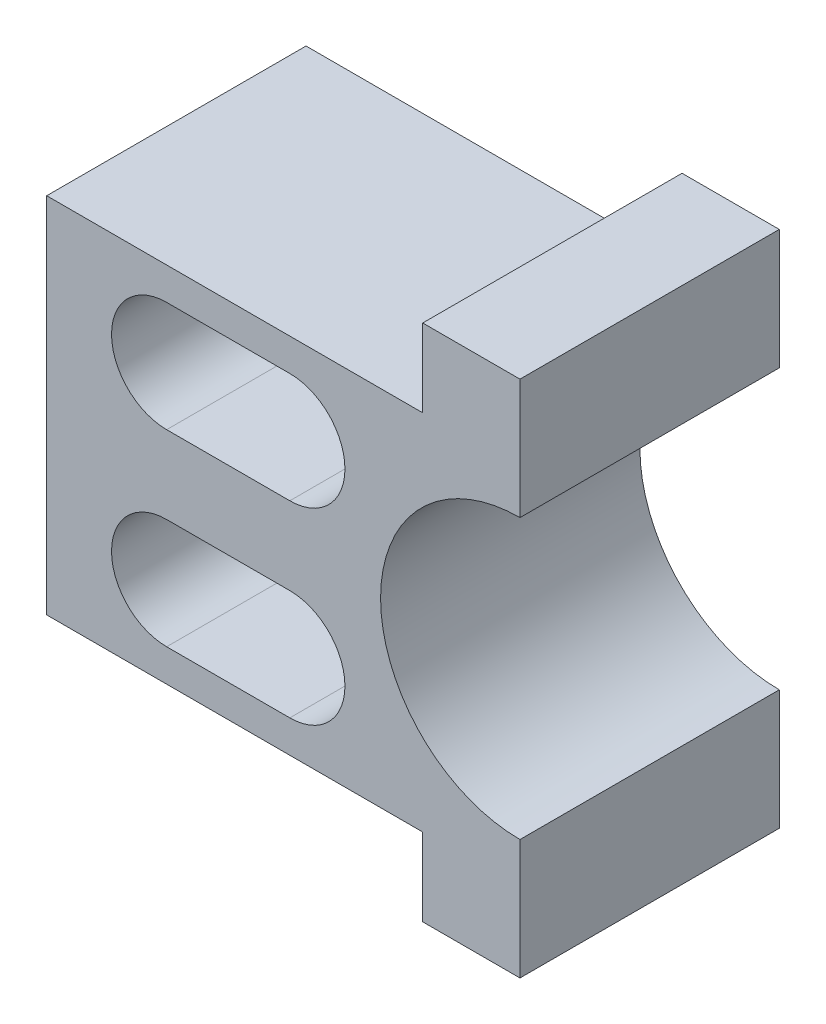
ISO-10303-21;
HEADER;
FILE_DESCRIPTION(('STEP AP214'),'2;1');
FILE_NAME('part.step','',(''),(''),'','','');
FILE_SCHEMA(('AUTOMOTIVE_DESIGN { 1 0 10303 214 1 1 1 1 }'));
ENDSEC;
DATA;
#1=APPLICATION_CONTEXT('core data for automotive mechanical design processes');
#2=APPLICATION_PROTOCOL_DEFINITION('international standard','automotive_design',2000,#1);
#3=PRODUCT_CONTEXT('',#1,'mechanical');
#4=PRODUCT('Part','Part','',(#3));
#5=PRODUCT_RELATED_PRODUCT_CATEGORY('part','',(#4));
#6=PRODUCT_DEFINITION_FORMATION('','',#4);
#7=PRODUCT_DEFINITION_CONTEXT('part definition',#1,'design');
#8=PRODUCT_DEFINITION('design','',#6,#7);
#9=PRODUCT_DEFINITION_SHAPE('','',#8);
#10=(LENGTH_UNIT() NAMED_UNIT(*) SI_UNIT(.MILLI.,.METRE.));
#11=(NAMED_UNIT(*) PLANE_ANGLE_UNIT() SI_UNIT($,.RADIAN.));
#12=(NAMED_UNIT(*) SI_UNIT($,.STERADIAN.) SOLID_ANGLE_UNIT());
#13=UNCERTAINTY_MEASURE_WITH_UNIT(LENGTH_MEASURE(1.E-05),#10,'distance_accuracy_value','');
#14=(GEOMETRIC_REPRESENTATION_CONTEXT(3) GLOBAL_UNCERTAINTY_ASSIGNED_CONTEXT((#13)) GLOBAL_UNIT_ASSIGNED_CONTEXT((#10,
#11,#12)) REPRESENTATION_CONTEXT('',''));
#15=CARTESIAN_POINT('',(0.,0.,0.));
#16=DIRECTION('',(0.,0.,1.));
#17=DIRECTION('',(1.,0.,0.));
#18=AXIS2_PLACEMENT_3D('',#15,#16,#17);
#19=CARTESIAN_POINT('',(0.,0.,40.));
#20=DIRECTION('',(0.,0.,-1.));
#21=DIRECTION('',(-1.,0.,0.));
#22=AXIS2_PLACEMENT_3D('',#19,#20,#21);
#23=PLANE('',#22);
#24=DIRECTION('',(1.,0.,0.));
#25=VECTOR('',#24,1.);
#26=CARTESIAN_POINT('',(-18.,-23.,40.));
#27=LINE('',#26,#25);
#28=CARTESIAN_POINT('',(-18.,-23.,40.));
#29=VERTEX_POINT('',#28);
#30=CARTESIAN_POINT('',(0.999999999999958,-23.,40.));
#31=VERTEX_POINT('',#30);
#32=EDGE_CURVE('E277',#29,#31,#27,.T.);
#33=ORIENTED_EDGE('',*,*,#32,.F.);
#34=CARTESIAN_POINT('',(-18.,-14.5,40.));
#35=DIRECTION('',(0.,0.,1.));
#36=DIRECTION('',(1.,0.,0.));
#37=AXIS2_PLACEMENT_3D('',#34,#35,#36);
#38=CIRCLE('',#37,8.5);
#39=CARTESIAN_POINT('',(-18.,-6.,40.));
#40=VERTEX_POINT('',#39);
#41=EDGE_CURVE('E274',#40,#29,#38,.T.);
#42=ORIENTED_EDGE('',*,*,#41,.F.);
#43=DIRECTION('',(-1.,0.,0.));
#44=VECTOR('',#43,1.);
#45=CARTESIAN_POINT('',(-18.,-6.,40.));
#46=LINE('',#45,#44);
#47=CARTESIAN_POINT('',(0.999999999999959,-6.,40.));
#48=VERTEX_POINT('',#47);
#49=EDGE_CURVE('E263',#48,#40,#46,.T.);
#50=ORIENTED_EDGE('',*,*,#49,.F.);
#51=CARTESIAN_POINT('',(0.999999999999959,-14.5,40.));
#52=DIRECTION('',(0.,0.,1.));
#53=DIRECTION('',(1.,0.,0.));
#54=AXIS2_PLACEMENT_3D('',#51,#52,#53);
#55=CIRCLE('',#54,8.5);
#56=EDGE_CURVE('E280',#31,#48,#55,.T.);
#57=ORIENTED_EDGE('',*,*,#56,.F.);
#58=EDGE_LOOP('',(#33,#42,#50,#57));
#59=FACE_BOUND('',#58,.T.);
#60=DIRECTION('',(1.,0.,0.));
#61=VECTOR('',#60,1.);
#62=CARTESIAN_POINT('',(-18.,6.,40.));
#63=LINE('',#62,#61);
#64=CARTESIAN_POINT('',(-18.,6.,40.));
#65=VERTEX_POINT('',#64);
#66=CARTESIAN_POINT('',(0.999999999999959,6.,40.));
#67=VERTEX_POINT('',#66);
#68=EDGE_CURVE('E243',#65,#67,#63,.T.);
#69=ORIENTED_EDGE('',*,*,#68,.F.);
#70=CARTESIAN_POINT('',(-18.,14.5,40.));
#71=DIRECTION('',(0.,0.,1.));
#72=DIRECTION('',(-1.,0.,0.));
#73=AXIS2_PLACEMENT_3D('',#70,#71,#72);
#74=CIRCLE('',#73,8.5);
#75=CARTESIAN_POINT('',(-18.,23.,40.));
#76=VERTEX_POINT('',#75);
#77=EDGE_CURVE('E240',#76,#65,#74,.T.);
#78=ORIENTED_EDGE('',*,*,#77,.F.);
#79=DIRECTION('',(-1.,0.,0.));
#80=VECTOR('',#79,1.);
#81=CARTESIAN_POINT('',(-18.,23.,40.));
#82=LINE('',#81,#80);
#83=CARTESIAN_POINT('',(0.999999999999959,23.,40.));
#84=VERTEX_POINT('',#83);
#85=EDGE_CURVE('E229',#84,#76,#82,.T.);
#86=ORIENTED_EDGE('',*,*,#85,.F.);
#87=CARTESIAN_POINT('',(0.999999999999959,14.5,40.));
#88=DIRECTION('',(0.,0.,1.));
#89=DIRECTION('',(-1.,0.,0.));
#90=AXIS2_PLACEMENT_3D('',#87,#88,#89);
#91=CIRCLE('',#90,8.5);
#92=EDGE_CURVE('E246',#67,#84,#91,.T.);
#93=ORIENTED_EDGE('',*,*,#92,.F.);
#94=EDGE_LOOP('',(#69,#78,#86,#93));
#95=FACE_BOUND('',#94,.T.);
#96=DIRECTION('',(1.,0.,0.));
#97=VECTOR('',#96,1.);
#98=CARTESIAN_POINT('',(-36.5,-28.,40.));
#99=LINE('',#98,#97);
#100=CARTESIAN_POINT('',(-36.5,-28.,40.));
#101=VERTEX_POINT('',#100);
#102=CARTESIAN_POINT('',(21.5,-28.,40.));
#103=VERTEX_POINT('',#102);
#104=EDGE_CURVE('E170',#101,#103,#99,.T.);
#105=ORIENTED_EDGE('',*,*,#104,.T.);
#106=DIRECTION('',(0.,1.,0.));
#107=VECTOR('',#106,1.);
#108=CARTESIAN_POINT('',(21.5,-40.,40.));
#109=LINE('',#108,#107);
#110=CARTESIAN_POINT('',(21.5,-40.,40.));
#111=VERTEX_POINT('',#110);
#112=EDGE_CURVE('E184',#111,#103,#109,.T.);
#113=ORIENTED_EDGE('',*,*,#112,.F.);
#114=DIRECTION('',(1.,0.,0.));
#115=VECTOR('',#114,1.);
#116=CARTESIAN_POINT('',(36.5,-40.,40.));
#117=LINE('',#116,#115);
#118=CARTESIAN_POINT('',(36.5,-40.,40.));
#119=VERTEX_POINT('',#118);
#120=EDGE_CURVE('E219',#111,#119,#117,.T.);
#121=ORIENTED_EDGE('',*,*,#120,.T.);
#122=DIRECTION('',(0.,1.,0.));
#123=VECTOR('',#122,1.);
#124=CARTESIAN_POINT('',(36.5,40.,40.));
#125=LINE('',#124,#123);
#126=CARTESIAN_POINT('',(36.5,-21.5,40.));
#127=VERTEX_POINT('',#126);
#128=EDGE_CURVE('E212',#119,#127,#125,.T.);
#129=ORIENTED_EDGE('',*,*,#128,.T.);
#130=CARTESIAN_POINT('',(36.5,0.,40.));
#131=DIRECTION('',(0.,0.,1.));
#132=DIRECTION('',(1.,0.,0.));
#133=AXIS2_PLACEMENT_3D('',#130,#131,#132);
#134=CIRCLE('',#133,21.5);
#135=CARTESIAN_POINT('',(36.5,21.5,40.));
#136=VERTEX_POINT('',#135);
#137=EDGE_CURVE('E276',#136,#127,#134,.T.);
#138=ORIENTED_EDGE('',*,*,#137,.F.);
#139=CARTESIAN_POINT('',(36.5,40.,40.));
#140=VERTEX_POINT('',#139);
#141=EDGE_CURVE('E216',#136,#140,#125,.T.);
#142=ORIENTED_EDGE('',*,*,#141,.T.);
#143=DIRECTION('',(-1.,0.,0.));
#144=VECTOR('',#143,1.);
#145=CARTESIAN_POINT('',(36.5,40.,40.));
#146=LINE('',#145,#144);
#147=CARTESIAN_POINT('',(21.5,40.,40.));
#148=VERTEX_POINT('',#147);
#149=EDGE_CURVE('E197',#140,#148,#146,.T.);
#150=ORIENTED_EDGE('',*,*,#149,.T.);
#151=DIRECTION('',(0.,-1.,0.));
#152=VECTOR('',#151,1.);
#153=CARTESIAN_POINT('',(21.5,40.,40.));
#154=LINE('',#153,#152);
#155=CARTESIAN_POINT('',(21.5,28.,40.));
#156=VERTEX_POINT('',#155);
#157=EDGE_CURVE('E175',#148,#156,#154,.T.);
#158=ORIENTED_EDGE('',*,*,#157,.T.);
#159=DIRECTION('',(1.,0.,0.));
#160=VECTOR('',#159,1.);
#161=CARTESIAN_POINT('',(-36.5,28.,40.));
#162=LINE('',#161,#160);
#163=CARTESIAN_POINT('',(-36.5,28.,40.));
#164=VERTEX_POINT('',#163);
#165=EDGE_CURVE('E300',#164,#156,#162,.T.);
#166=ORIENTED_EDGE('',*,*,#165,.F.);
#167=DIRECTION('',(0.,-1.,0.));
#168=VECTOR('',#167,1.);
#169=CARTESIAN_POINT('',(-36.5,40.,40.));
#170=LINE('',#169,#168);
#171=EDGE_CURVE('E205',#164,#101,#170,.T.);
#172=ORIENTED_EDGE('',*,*,#171,.T.);
#173=EDGE_LOOP('',(#105,#113,#121,#129,#138,#142,#150,#158,#166,#172));
#174=FACE_BOUND('',#173,.T.);
#175=ADVANCED_FACE('F40',(#59,#95,#174),#23,.F.);
#176=CARTESIAN_POINT('',(0.,0.,0.));
#177=DIRECTION('',(0.,0.,-1.));
#178=DIRECTION('',(-1.,0.,0.));
#179=AXIS2_PLACEMENT_3D('',#176,#177,#178);
#180=PLANE('',#179);
#181=CARTESIAN_POINT('',(-18.,-14.5,0.));
#182=DIRECTION('',(0.,0.,1.));
#183=DIRECTION('',(1.,0.,0.));
#184=AXIS2_PLACEMENT_3D('',#181,#182,#183);
#185=CIRCLE('',#184,8.5);
#186=CARTESIAN_POINT('',(-18.,-6.,0.));
#187=VERTEX_POINT('',#186);
#188=CARTESIAN_POINT('',(-18.,-23.,0.));
#189=VERTEX_POINT('',#188);
#190=EDGE_CURVE('E260',#187,#189,#185,.T.);
#191=ORIENTED_EDGE('',*,*,#190,.T.);
#192=DIRECTION('',(1.,0.,0.));
#193=VECTOR('',#192,1.);
#194=CARTESIAN_POINT('',(-18.,-23.,0.));
#195=LINE('',#194,#193);
#196=CARTESIAN_POINT('',(0.999999999999958,-23.,0.));
#197=VERTEX_POINT('',#196);
#198=EDGE_CURVE('E264',#189,#197,#195,.T.);
#199=ORIENTED_EDGE('',*,*,#198,.T.);
#200=CARTESIAN_POINT('',(0.999999999999959,-14.5,0.));
#201=DIRECTION('',(0.,0.,1.));
#202=DIRECTION('',(1.,0.,0.));
#203=AXIS2_PLACEMENT_3D('',#200,#201,#202);
#204=CIRCLE('',#203,8.5);
#205=CARTESIAN_POINT('',(0.999999999999959,-6.,0.));
#206=VERTEX_POINT('',#205);
#207=EDGE_CURVE('E267',#197,#206,#204,.T.);
#208=ORIENTED_EDGE('',*,*,#207,.T.);
#209=DIRECTION('',(-1.,0.,0.));
#210=VECTOR('',#209,1.);
#211=CARTESIAN_POINT('',(-18.,-6.,0.));
#212=LINE('',#211,#210);
#213=EDGE_CURVE('E270',#206,#187,#212,.T.);
#214=ORIENTED_EDGE('',*,*,#213,.T.);
#215=EDGE_LOOP('',(#191,#199,#208,#214));
#216=FACE_BOUND('',#215,.T.);
#217=CARTESIAN_POINT('',(-18.,14.5,0.));
#218=DIRECTION('',(0.,0.,1.));
#219=DIRECTION('',(-1.,0.,0.));
#220=AXIS2_PLACEMENT_3D('',#217,#218,#219);
#221=CIRCLE('',#220,8.5);
#222=CARTESIAN_POINT('',(-18.,23.,0.));
#223=VERTEX_POINT('',#222);
#224=CARTESIAN_POINT('',(-18.,6.,0.));
#225=VERTEX_POINT('',#224);
#226=EDGE_CURVE('E226',#223,#225,#221,.T.);
#227=ORIENTED_EDGE('',*,*,#226,.T.);
#228=DIRECTION('',(1.,0.,0.));
#229=VECTOR('',#228,1.);
#230=CARTESIAN_POINT('',(-18.,6.,0.));
#231=LINE('',#230,#229);
#232=CARTESIAN_POINT('',(0.999999999999959,6.,0.));
#233=VERTEX_POINT('',#232);
#234=EDGE_CURVE('E230',#225,#233,#231,.T.);
#235=ORIENTED_EDGE('',*,*,#234,.T.);
#236=CARTESIAN_POINT('',(0.999999999999959,14.5,0.));
#237=DIRECTION('',(0.,0.,1.));
#238=DIRECTION('',(-1.,0.,0.));
#239=AXIS2_PLACEMENT_3D('',#236,#237,#238);
#240=CIRCLE('',#239,8.5);
#241=CARTESIAN_POINT('',(0.999999999999959,23.,0.));
#242=VERTEX_POINT('',#241);
#243=EDGE_CURVE('E233',#233,#242,#240,.T.);
#244=ORIENTED_EDGE('',*,*,#243,.T.);
#245=DIRECTION('',(-1.,0.,0.));
#246=VECTOR('',#245,1.);
#247=CARTESIAN_POINT('',(-18.,23.,0.));
#248=LINE('',#247,#246);
#249=EDGE_CURVE('E236',#242,#223,#248,.T.);
#250=ORIENTED_EDGE('',*,*,#249,.T.);
#251=EDGE_LOOP('',(#227,#235,#244,#250));
#252=FACE_BOUND('',#251,.T.);
#253=DIRECTION('',(0.,1.,0.));
#254=VECTOR('',#253,1.);
#255=CARTESIAN_POINT('',(21.5,-40.,0.));
#256=LINE('',#255,#254);
#257=CARTESIAN_POINT('',(21.5,-40.,0.));
#258=VERTEX_POINT('',#257);
#259=CARTESIAN_POINT('',(21.5,-28.,0.));
#260=VERTEX_POINT('',#259);
#261=EDGE_CURVE('E55',#258,#260,#256,.T.);
#262=ORIENTED_EDGE('',*,*,#261,.T.);
#263=DIRECTION('',(1.,0.,0.));
#264=VECTOR('',#263,1.);
#265=CARTESIAN_POINT('',(-36.5,-28.,0.));
#266=LINE('',#265,#264);
#267=CARTESIAN_POINT('',(-36.5,-28.,0.));
#268=VERTEX_POINT('',#267);
#269=EDGE_CURVE('E168',#268,#260,#266,.T.);
#270=ORIENTED_EDGE('',*,*,#269,.F.);
#271=DIRECTION('',(0.,-1.,0.));
#272=VECTOR('',#271,1.);
#273=CARTESIAN_POINT('',(-36.5,40.,0.));
#274=LINE('',#273,#272);
#275=CARTESIAN_POINT('',(-36.5,28.,0.));
#276=VERTEX_POINT('',#275);
#277=EDGE_CURVE('E182',#276,#268,#274,.T.);
#278=ORIENTED_EDGE('',*,*,#277,.F.);
#279=DIRECTION('',(1.,0.,0.));
#280=VECTOR('',#279,1.);
#281=CARTESIAN_POINT('',(-36.5,28.,0.));
#282=LINE('',#281,#280);
#283=CARTESIAN_POINT('',(21.5,28.,0.));
#284=VERTEX_POINT('',#283);
#285=EDGE_CURVE('E299',#276,#284,#282,.T.);
#286=ORIENTED_EDGE('',*,*,#285,.T.);
#287=DIRECTION('',(0.,-1.,0.));
#288=VECTOR('',#287,1.);
#289=CARTESIAN_POINT('',(21.5,40.,0.));
#290=LINE('',#289,#288);
#291=CARTESIAN_POINT('',(21.5,40.,0.));
#292=VERTEX_POINT('',#291);
#293=EDGE_CURVE('E302',#292,#284,#290,.T.);
#294=ORIENTED_EDGE('',*,*,#293,.F.);
#295=DIRECTION('',(-1.,0.,0.));
#296=VECTOR('',#295,1.);
#297=CARTESIAN_POINT('',(36.5,40.,0.));
#298=LINE('',#297,#296);
#299=CARTESIAN_POINT('',(36.5,40.,0.));
#300=VERTEX_POINT('',#299);
#301=EDGE_CURVE('E203',#300,#292,#298,.T.);
#302=ORIENTED_EDGE('',*,*,#301,.F.);
#303=DIRECTION('',(0.,1.,0.));
#304=VECTOR('',#303,1.);
#305=CARTESIAN_POINT('',(36.5,40.,0.));
#306=LINE('',#305,#304);
#307=CARTESIAN_POINT('',(36.5,21.5,0.));
#308=VERTEX_POINT('',#307);
#309=EDGE_CURVE('E191',#308,#300,#306,.T.);
#310=ORIENTED_EDGE('',*,*,#309,.F.);
#311=CARTESIAN_POINT('',(36.5,0.,0.));
#312=DIRECTION('',(0.,0.,1.));
#313=DIRECTION('',(1.,0.,0.));
#314=AXIS2_PLACEMENT_3D('',#311,#312,#313);
#315=CIRCLE('',#314,21.5);
#316=CARTESIAN_POINT('',(36.5,-21.5,0.));
#317=VERTEX_POINT('',#316);
#318=EDGE_CURVE('E225',#308,#317,#315,.T.);
#319=ORIENTED_EDGE('',*,*,#318,.T.);
#320=CARTESIAN_POINT('',(36.5,-40.,0.));
#321=VERTEX_POINT('',#320);
#322=EDGE_CURVE('E200',#321,#317,#306,.T.);
#323=ORIENTED_EDGE('',*,*,#322,.F.);
#324=DIRECTION('',(1.,0.,0.));
#325=VECTOR('',#324,1.);
#326=CARTESIAN_POINT('',(36.5,-40.,0.));
#327=LINE('',#326,#325);
#328=EDGE_CURVE('E188',#258,#321,#327,.T.);
#329=ORIENTED_EDGE('',*,*,#328,.F.);
#330=EDGE_LOOP('',(#262,#270,#278,#286,#294,#302,#310,#319,#323,#329));
#331=FACE_BOUND('',#330,.T.);
#332=ADVANCED_FACE('F180',(#216,#252,#331),#180,.T.);
#333=CARTESIAN_POINT('',(-36.5,40.,40.));
#334=DIRECTION('',(1.,0.,0.));
#335=DIRECTION('',(0.,1.,0.));
#336=AXIS2_PLACEMENT_3D('',#333,#334,#335);
#337=PLANE('',#336);
#338=DIRECTION('',(0.,0.,1.));
#339=VECTOR('',#338,1.);
#340=CARTESIAN_POINT('',(-36.5,-28.,0.));
#341=LINE('',#340,#339);
#342=EDGE_CURVE('E165',#268,#101,#341,.T.);
#343=ORIENTED_EDGE('',*,*,#342,.T.);
#344=ORIENTED_EDGE('',*,*,#171,.F.);
#345=DIRECTION('',(0.,0.,1.));
#346=VECTOR('',#345,1.);
#347=CARTESIAN_POINT('',(-36.5,28.,0.));
#348=LINE('',#347,#346);
#349=EDGE_CURVE('E187',#276,#164,#348,.T.);
#350=ORIENTED_EDGE('',*,*,#349,.F.);
#351=ORIENTED_EDGE('',*,*,#277,.T.);
#352=EDGE_LOOP('',(#343,#344,#350,#351));
#353=FACE_BOUND('',#352,.T.);
#354=ADVANCED_FACE('F42',(#353),#337,.F.);
#355=CARTESIAN_POINT('',(36.5,40.,40.));
#356=DIRECTION('',(0.,-1.,0.));
#357=DIRECTION('',(1.,0.,0.));
#358=AXIS2_PLACEMENT_3D('',#355,#356,#357);
#359=PLANE('',#358);
#360=DIRECTION('',(0.,0.,1.));
#361=VECTOR('',#360,1.);
#362=CARTESIAN_POINT('',(21.5,40.,0.));
#363=LINE('',#362,#361);
#364=EDGE_CURVE('E254',#292,#148,#363,.T.);
#365=ORIENTED_EDGE('',*,*,#364,.T.);
#366=ORIENTED_EDGE('',*,*,#149,.F.);
#367=DIRECTION('',(0.,0.,-1.));
#368=VECTOR('',#367,1.);
#369=CARTESIAN_POINT('',(36.5,40.,40.));
#370=LINE('',#369,#368);
#371=EDGE_CURVE('E48',#140,#300,#370,.T.);
#372=ORIENTED_EDGE('',*,*,#371,.T.);
#373=ORIENTED_EDGE('',*,*,#301,.T.);
#374=EDGE_LOOP('',(#365,#366,#372,#373));
#375=FACE_BOUND('',#374,.T.);
#376=ADVANCED_FACE('F319',(#375),#359,.F.);
#377=CARTESIAN_POINT('',(36.5,40.,40.));
#378=DIRECTION('',(-1.,0.,0.));
#379=DIRECTION('',(0.,-1.,0.));
#380=AXIS2_PLACEMENT_3D('',#377,#378,#379);
#381=PLANE('',#380);
#382=ORIENTED_EDGE('',*,*,#322,.T.);
#383=DIRECTION('',(0.,0.,1.));
#384=VECTOR('',#383,1.);
#385=CARTESIAN_POINT('',(36.5,-21.5,0.));
#386=LINE('',#385,#384);
#387=EDGE_CURVE('E189',#317,#127,#386,.T.);
#388=ORIENTED_EDGE('',*,*,#387,.T.);
#389=ORIENTED_EDGE('',*,*,#128,.F.);
#390=DIRECTION('',(0.,0.,-1.));
#391=VECTOR('',#390,1.);
#392=CARTESIAN_POINT('',(36.5,-40.,40.));
#393=LINE('',#392,#391);
#394=EDGE_CURVE('E11',#119,#321,#393,.T.);
#395=ORIENTED_EDGE('',*,*,#394,.T.);
#396=EDGE_LOOP('',(#382,#388,#389,#395));
#397=FACE_BOUND('',#396,.T.);
#398=ADVANCED_FACE('F348',(#397),#381,.F.);
#399=CARTESIAN_POINT('',(36.5,-40.,40.));
#400=DIRECTION('',(0.,1.,0.));
#401=DIRECTION('',(-1.,0.,0.));
#402=AXIS2_PLACEMENT_3D('',#399,#400,#401);
#403=PLANE('',#402);
#404=ORIENTED_EDGE('',*,*,#120,.F.);
#405=DIRECTION('',(0.,0.,1.));
#406=VECTOR('',#405,1.);
#407=CARTESIAN_POINT('',(21.5,-40.,0.));
#408=LINE('',#407,#406);
#409=EDGE_CURVE('E307',#258,#111,#408,.T.);
#410=ORIENTED_EDGE('',*,*,#409,.F.);
#411=ORIENTED_EDGE('',*,*,#328,.T.);
#412=ORIENTED_EDGE('',*,*,#394,.F.);
#413=EDGE_LOOP('',(#404,#410,#411,#412));
#414=FACE_BOUND('',#413,.T.);
#415=ADVANCED_FACE('F352',(#414),#403,.F.);
#416=ORIENTED_EDGE('',*,*,#141,.F.);
#417=DIRECTION('',(0.,0.,1.));
#418=VECTOR('',#417,1.);
#419=CARTESIAN_POINT('',(36.5,21.5,0.));
#420=LINE('',#419,#418);
#421=EDGE_CURVE('E194',#136,#308,#420,.F.);
#422=ORIENTED_EDGE('',*,*,#421,.T.);
#423=ORIENTED_EDGE('',*,*,#309,.T.);
#424=ORIENTED_EDGE('',*,*,#371,.F.);
#425=EDGE_LOOP('',(#416,#422,#423,#424));
#426=FACE_BOUND('',#425,.T.);
#427=ADVANCED_FACE('F349',(#426),#381,.F.);
#428=CARTESIAN_POINT('',(-18.,14.5,0.));
#429=DIRECTION('',(0.,0.,1.));
#430=DIRECTION('',(1.,0.,0.));
#431=AXIS2_PLACEMENT_3D('',#428,#429,#430);
#432=CYLINDRICAL_SURFACE('',#431,8.5);
#433=ORIENTED_EDGE('',*,*,#77,.T.);
#434=DIRECTION('',(0.,0.,1.));
#435=VECTOR('',#434,1.);
#436=CARTESIAN_POINT('',(-18.,6.,0.));
#437=LINE('',#436,#435);
#438=EDGE_CURVE('E239',#225,#65,#437,.T.);
#439=ORIENTED_EDGE('',*,*,#438,.F.);
#440=ORIENTED_EDGE('',*,*,#226,.F.);
#441=DIRECTION('',(0.,0.,1.));
#442=VECTOR('',#441,1.);
#443=CARTESIAN_POINT('',(-18.,23.,0.));
#444=LINE('',#443,#442);
#445=EDGE_CURVE('E251',#223,#76,#444,.T.);
#446=ORIENTED_EDGE('',*,*,#445,.T.);
#447=EDGE_LOOP('',(#433,#439,#440,#446));
#448=FACE_BOUND('',#447,.T.);
#449=ADVANCED_FACE('F351',(#448),#432,.F.);
#450=CARTESIAN_POINT('',(-18.,23.,0.));
#451=DIRECTION('',(0.,1.,0.));
#452=DIRECTION('',(0.,0.,1.));
#453=AXIS2_PLACEMENT_3D('',#450,#451,#452);
#454=PLANE('',#453);
#455=ORIENTED_EDGE('',*,*,#85,.T.);
#456=ORIENTED_EDGE('',*,*,#445,.F.);
#457=ORIENTED_EDGE('',*,*,#249,.F.);
#458=DIRECTION('',(0.,0.,1.));
#459=VECTOR('',#458,1.);
#460=CARTESIAN_POINT('',(0.999999999999959,23.,0.));
#461=LINE('',#460,#459);
#462=EDGE_CURVE('E253',#242,#84,#461,.T.);
#463=ORIENTED_EDGE('',*,*,#462,.T.);
#464=EDGE_LOOP('',(#455,#456,#457,#463));
#465=FACE_BOUND('',#464,.T.);
#466=ADVANCED_FACE('F344',(#465),#454,.F.);
#467=CARTESIAN_POINT('',(0.999999999999959,14.5,0.));
#468=DIRECTION('',(0.,0.,1.));
#469=DIRECTION('',(1.,0.,0.));
#470=AXIS2_PLACEMENT_3D('',#467,#468,#469);
#471=CYLINDRICAL_SURFACE('',#470,8.5);
#472=ORIENTED_EDGE('',*,*,#92,.T.);
#473=ORIENTED_EDGE('',*,*,#462,.F.);
#474=ORIENTED_EDGE('',*,*,#243,.F.);
#475=DIRECTION('',(0.,0.,1.));
#476=VECTOR('',#475,1.);
#477=CARTESIAN_POINT('',(0.999999999999959,6.,0.));
#478=LINE('',#477,#476);
#479=EDGE_CURVE('E256',#233,#67,#478,.T.);
#480=ORIENTED_EDGE('',*,*,#479,.T.);
#481=EDGE_LOOP('',(#472,#473,#474,#480));
#482=FACE_BOUND('',#481,.T.);
#483=ADVANCED_FACE('F463',(#482),#471,.F.);
#484=CARTESIAN_POINT('',(-18.,6.,0.));
#485=DIRECTION('',(0.,-1.,0.));
#486=DIRECTION('',(0.,0.,-1.));
#487=AXIS2_PLACEMENT_3D('',#484,#485,#486);
#488=PLANE('',#487);
#489=ORIENTED_EDGE('',*,*,#68,.T.);
#490=ORIENTED_EDGE('',*,*,#479,.F.);
#491=ORIENTED_EDGE('',*,*,#234,.F.);
#492=ORIENTED_EDGE('',*,*,#438,.T.);
#493=EDGE_LOOP('',(#489,#490,#491,#492));
#494=FACE_BOUND('',#493,.T.);
#495=ADVANCED_FACE('F453',(#494),#488,.F.);
#496=CARTESIAN_POINT('',(-18.,-14.5,0.));
#497=DIRECTION('',(0.,0.,1.));
#498=DIRECTION('',(1.,0.,0.));
#499=AXIS2_PLACEMENT_3D('',#496,#497,#498);
#500=CYLINDRICAL_SURFACE('',#499,8.5);
#501=ORIENTED_EDGE('',*,*,#41,.T.);
#502=DIRECTION('',(0.,0.,1.));
#503=VECTOR('',#502,1.);
#504=CARTESIAN_POINT('',(-18.,-23.,0.));
#505=LINE('',#504,#503);
#506=EDGE_CURVE('E273',#189,#29,#505,.T.);
#507=ORIENTED_EDGE('',*,*,#506,.F.);
#508=ORIENTED_EDGE('',*,*,#190,.F.);
#509=DIRECTION('',(0.,0.,1.));
#510=VECTOR('',#509,1.);
#511=CARTESIAN_POINT('',(-18.,-6.,0.));
#512=LINE('',#511,#510);
#513=EDGE_CURVE('E242',#187,#40,#512,.T.);
#514=ORIENTED_EDGE('',*,*,#513,.T.);
#515=EDGE_LOOP('',(#501,#507,#508,#514));
#516=FACE_BOUND('',#515,.T.);
#517=ADVANCED_FACE('F443',(#516),#500,.F.);
#518=CARTESIAN_POINT('',(-18.,-6.,0.));
#519=DIRECTION('',(0.,1.,0.));
#520=DIRECTION('',(0.,0.,1.));
#521=AXIS2_PLACEMENT_3D('',#518,#519,#520);
#522=PLANE('',#521);
#523=ORIENTED_EDGE('',*,*,#49,.T.);
#524=ORIENTED_EDGE('',*,*,#513,.F.);
#525=ORIENTED_EDGE('',*,*,#213,.F.);
#526=DIRECTION('',(0.,0.,1.));
#527=VECTOR('',#526,1.);
#528=CARTESIAN_POINT('',(0.999999999999959,-6.,0.));
#529=LINE('',#528,#527);
#530=EDGE_CURVE('E286',#206,#48,#529,.T.);
#531=ORIENTED_EDGE('',*,*,#530,.T.);
#532=EDGE_LOOP('',(#523,#524,#525,#531));
#533=FACE_BOUND('',#532,.T.);
#534=ADVANCED_FACE('F433',(#533),#522,.F.);
#535=CARTESIAN_POINT('',(0.999999999999959,-14.5,0.));
#536=DIRECTION('',(0.,0.,1.));
#537=DIRECTION('',(1.,0.,0.));
#538=AXIS2_PLACEMENT_3D('',#535,#536,#537);
#539=CYLINDRICAL_SURFACE('',#538,8.5);
#540=ORIENTED_EDGE('',*,*,#56,.T.);
#541=ORIENTED_EDGE('',*,*,#530,.F.);
#542=ORIENTED_EDGE('',*,*,#207,.F.);
#543=DIRECTION('',(0.,0.,1.));
#544=VECTOR('',#543,1.);
#545=CARTESIAN_POINT('',(0.999999999999958,-23.,0.));
#546=LINE('',#545,#544);
#547=EDGE_CURVE('E288',#197,#31,#546,.T.);
#548=ORIENTED_EDGE('',*,*,#547,.T.);
#549=EDGE_LOOP('',(#540,#541,#542,#548));
#550=FACE_BOUND('',#549,.T.);
#551=ADVANCED_FACE('F423',(#550),#539,.F.);
#552=CARTESIAN_POINT('',(-18.,-23.,0.));
#553=DIRECTION('',(0.,-1.,0.));
#554=DIRECTION('',(0.,0.,-1.));
#555=AXIS2_PLACEMENT_3D('',#552,#553,#554);
#556=PLANE('',#555);
#557=ORIENTED_EDGE('',*,*,#32,.T.);
#558=ORIENTED_EDGE('',*,*,#547,.F.);
#559=ORIENTED_EDGE('',*,*,#198,.F.);
#560=ORIENTED_EDGE('',*,*,#506,.T.);
#561=EDGE_LOOP('',(#557,#558,#559,#560));
#562=FACE_BOUND('',#561,.T.);
#563=ADVANCED_FACE('F330',(#562),#556,.F.);
#564=CARTESIAN_POINT('',(36.5,0.,0.));
#565=DIRECTION('',(0.,0.,1.));
#566=DIRECTION('',(1.,0.,0.));
#567=AXIS2_PLACEMENT_3D('',#564,#565,#566);
#568=CYLINDRICAL_SURFACE('',#567,21.5);
#569=ORIENTED_EDGE('',*,*,#318,.F.);
#570=ORIENTED_EDGE('',*,*,#421,.F.);
#571=ORIENTED_EDGE('',*,*,#137,.T.);
#572=ORIENTED_EDGE('',*,*,#387,.F.);
#573=EDGE_LOOP('',(#569,#570,#571,#572));
#574=FACE_BOUND('',#573,.T.);
#575=ADVANCED_FACE('F322',(#574),#568,.F.);
#576=CARTESIAN_POINT('',(21.5,40.,0.));
#577=DIRECTION('',(-1.,0.,0.));
#578=DIRECTION('',(0.,0.,1.));
#579=AXIS2_PLACEMENT_3D('',#576,#577,#578);
#580=PLANE('',#579);
#581=ORIENTED_EDGE('',*,*,#157,.F.);
#582=ORIENTED_EDGE('',*,*,#364,.F.);
#583=ORIENTED_EDGE('',*,*,#293,.T.);
#584=DIRECTION('',(0.,0.,1.));
#585=VECTOR('',#584,1.);
#586=CARTESIAN_POINT('',(21.5,28.,0.));
#587=LINE('',#586,#585);
#588=EDGE_CURVE('E63',#284,#156,#587,.T.);
#589=ORIENTED_EDGE('',*,*,#588,.T.);
#590=EDGE_LOOP('',(#581,#582,#583,#589));
#591=FACE_BOUND('',#590,.T.);
#592=ADVANCED_FACE('F320',(#591),#580,.T.);
#593=CARTESIAN_POINT('',(-36.5,28.,0.));
#594=DIRECTION('',(0.,-1.,0.));
#595=DIRECTION('',(0.,0.,-1.));
#596=AXIS2_PLACEMENT_3D('',#593,#594,#595);
#597=PLANE('',#596);
#598=ORIENTED_EDGE('',*,*,#165,.T.);
#599=ORIENTED_EDGE('',*,*,#588,.F.);
#600=ORIENTED_EDGE('',*,*,#285,.F.);
#601=ORIENTED_EDGE('',*,*,#349,.T.);
#602=EDGE_LOOP('',(#598,#599,#600,#601));
#603=FACE_BOUND('',#602,.T.);
#604=ADVANCED_FACE('F315',(#603),#597,.F.);
#605=CARTESIAN_POINT('',(-36.5,-28.,0.));
#606=DIRECTION('',(0.,-1.,0.));
#607=DIRECTION('',(0.,0.,-1.));
#608=AXIS2_PLACEMENT_3D('',#605,#606,#607);
#609=PLANE('',#608);
#610=ORIENTED_EDGE('',*,*,#104,.F.);
#611=ORIENTED_EDGE('',*,*,#342,.F.);
#612=ORIENTED_EDGE('',*,*,#269,.T.);
#613=DIRECTION('',(0.,0.,1.));
#614=VECTOR('',#613,1.);
#615=CARTESIAN_POINT('',(21.5,-28.,0.));
#616=LINE('',#615,#614);
#617=EDGE_CURVE('E176',#260,#103,#616,.T.);
#618=ORIENTED_EDGE('',*,*,#617,.T.);
#619=EDGE_LOOP('',(#610,#611,#612,#618));
#620=FACE_BOUND('',#619,.T.);
#621=ADVANCED_FACE('F167',(#620),#609,.T.);
#622=CARTESIAN_POINT('',(21.5,-40.,0.));
#623=DIRECTION('',(1.,0.,0.));
#624=DIRECTION('',(0.,0.,-1.));
#625=AXIS2_PLACEMENT_3D('',#622,#623,#624);
#626=PLANE('',#625);
#627=ORIENTED_EDGE('',*,*,#112,.T.);
#628=ORIENTED_EDGE('',*,*,#617,.F.);
#629=ORIENTED_EDGE('',*,*,#261,.F.);
#630=ORIENTED_EDGE('',*,*,#409,.T.);
#631=EDGE_LOOP('',(#627,#628,#629,#630));
#632=FACE_BOUND('',#631,.T.);
#633=ADVANCED_FACE('F365',(#632),#626,.F.);
#634=CLOSED_SHELL('',(#175,#332,#354,#376,#398,#415,#427,#449,#466,#483,#495,#517,#534,#551,
#563,#575,#592,#604,#621,#633));
#635=MANIFOLD_SOLID_BREP('B2',#634);
#636=ADVANCED_BREP_SHAPE_REPRESENTATION('',(#18,#635),#14);
#637=SHAPE_DEFINITION_REPRESENTATION(#9,#636);
ENDSEC;
END-ISO-10303-21;
